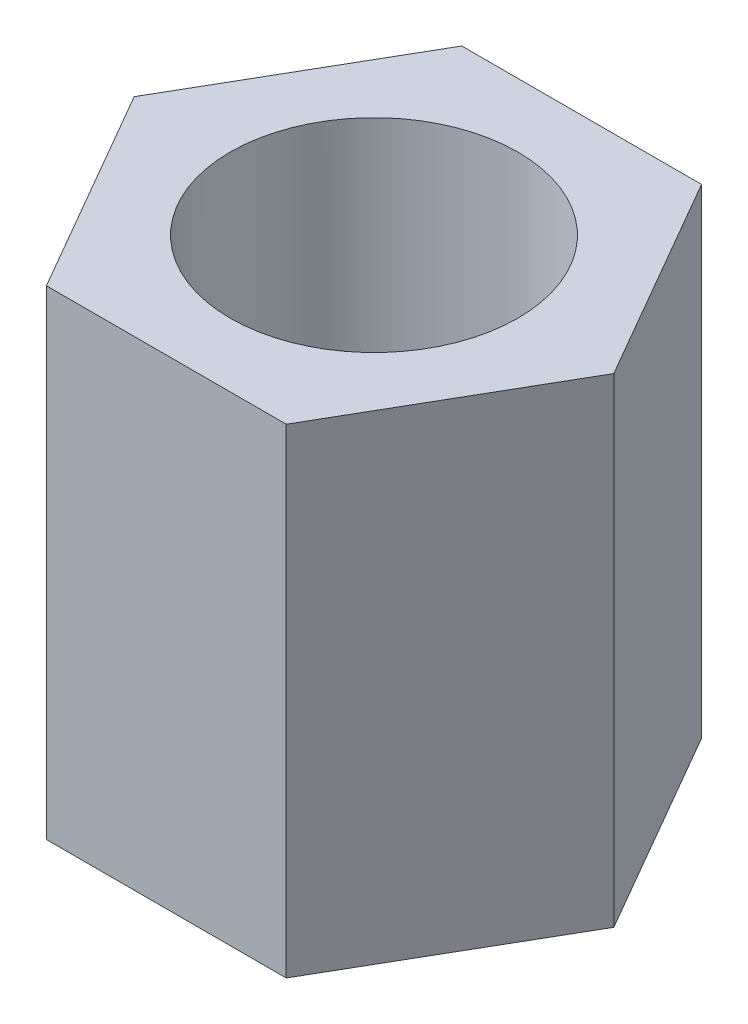
ISO-10303-21;
HEADER;
FILE_DESCRIPTION(('STEP AP214'),'2;1');
FILE_NAME('part.step','',(''),(''),'','','');
FILE_SCHEMA(('AUTOMOTIVE_DESIGN { 1 0 10303 214 1 1 1 1 }'));
ENDSEC;
DATA;
#1=APPLICATION_CONTEXT('core data for automotive mechanical design processes');
#2=APPLICATION_PROTOCOL_DEFINITION('international standard','automotive_design',2000,#1);
#3=PRODUCT_CONTEXT('',#1,'mechanical');
#4=PRODUCT('Part','Part','',(#3));
#5=PRODUCT_RELATED_PRODUCT_CATEGORY('part','',(#4));
#6=PRODUCT_DEFINITION_FORMATION('','',#4);
#7=PRODUCT_DEFINITION_CONTEXT('part definition',#1,'design');
#8=PRODUCT_DEFINITION('design','',#6,#7);
#9=PRODUCT_DEFINITION_SHAPE('','',#8);
#10=(LENGTH_UNIT() NAMED_UNIT(*) SI_UNIT(.MILLI.,.METRE.));
#11=(NAMED_UNIT(*) PLANE_ANGLE_UNIT() SI_UNIT($,.RADIAN.));
#12=(NAMED_UNIT(*) SI_UNIT($,.STERADIAN.) SOLID_ANGLE_UNIT());
#13=UNCERTAINTY_MEASURE_WITH_UNIT(LENGTH_MEASURE(1.E-05),#10,'distance_accuracy_value','');
#14=(GEOMETRIC_REPRESENTATION_CONTEXT(3) GLOBAL_UNCERTAINTY_ASSIGNED_CONTEXT((#13)) GLOBAL_UNIT_ASSIGNED_CONTEXT((#10,
#11,#12)) REPRESENTATION_CONTEXT('',''));
#15=CARTESIAN_POINT('',(0.,0.,0.));
#16=DIRECTION('',(0.,0.,1.));
#17=DIRECTION('',(1.,0.,0.));
#18=AXIS2_PLACEMENT_3D('',#15,#16,#17);
#19=CARTESIAN_POINT('',(0.,5.,0.));
#20=DIRECTION('',(0.,1.,0.));
#21=DIRECTION('',(0.,0.,1.));
#22=AXIS2_PLACEMENT_3D('',#19,#20,#21);
#23=PLANE('',#22);
#24=DIRECTION('',(1.,0.,0.));
#25=VECTOR('',#24,1.);
#26=CARTESIAN_POINT('',(-1.25,5.,2.1650635094611));
#27=LINE('',#26,#25);
#28=CARTESIAN_POINT('',(-1.25,5.,2.1650635094611));
#29=VERTEX_POINT('',#28);
#30=CARTESIAN_POINT('',(1.25,5.,2.1650635094611));
#31=VERTEX_POINT('',#30);
#32=EDGE_CURVE('E129',#29,#31,#27,.T.);
#33=ORIENTED_EDGE('',*,*,#32,.T.);
#34=DIRECTION('',(0.5,0.,-0.866025403784439));
#35=VECTOR('',#34,1.);
#36=CARTESIAN_POINT('',(1.25,5.,2.1650635094611));
#37=LINE('',#36,#35);
#38=CARTESIAN_POINT('',(2.5,5.,0.));
#39=VERTEX_POINT('',#38);
#40=EDGE_CURVE('E87',#31,#39,#37,.T.);
#41=ORIENTED_EDGE('',*,*,#40,.T.);
#42=DIRECTION('',(-0.499999999999999,0.,-0.866025403784439));
#43=VECTOR('',#42,1.);
#44=CARTESIAN_POINT('',(2.5,5.,0.));
#45=LINE('',#44,#43);
#46=CARTESIAN_POINT('',(1.25,5.,-2.1650635094611));
#47=VERTEX_POINT('',#46);
#48=EDGE_CURVE('E100',#39,#47,#45,.T.);
#49=ORIENTED_EDGE('',*,*,#48,.T.);
#50=DIRECTION('',(-1.,0.,0.));
#51=VECTOR('',#50,1.);
#52=CARTESIAN_POINT('',(1.25,5.,-2.1650635094611));
#53=LINE('',#52,#51);
#54=CARTESIAN_POINT('',(-1.25,5.,-2.1650635094611));
#55=VERTEX_POINT('',#54);
#56=EDGE_CURVE('E94',#47,#55,#53,.T.);
#57=ORIENTED_EDGE('',*,*,#56,.T.);
#58=DIRECTION('',(-0.5,0.,0.866025403784438));
#59=VECTOR('',#58,1.);
#60=CARTESIAN_POINT('',(-1.25,5.,-2.1650635094611));
#61=LINE('',#60,#59);
#62=CARTESIAN_POINT('',(-2.5,5.,0.));
#63=VERTEX_POINT('',#62);
#64=EDGE_CURVE('E98',#55,#63,#61,.T.);
#65=ORIENTED_EDGE('',*,*,#64,.T.);
#66=DIRECTION('',(0.499999999999999,0.,0.866025403784439));
#67=VECTOR('',#66,1.);
#68=CARTESIAN_POINT('',(-2.5,5.,0.));
#69=LINE('',#68,#67);
#70=EDGE_CURVE('E50',#63,#29,#69,.T.);
#71=ORIENTED_EDGE('',*,*,#70,.T.);
#72=EDGE_LOOP('',(#33,#41,#49,#57,#65,#71));
#73=FACE_BOUND('',#72,.T.);
#74=CARTESIAN_POINT('',(0.,5.,0.));
#75=DIRECTION('',(0.,1.,0.));
#76=DIRECTION('',(0.,0.,1.));
#77=AXIS2_PLACEMENT_3D('',#74,#75,#76);
#78=CIRCLE('',#77,1.5);
#79=CARTESIAN_POINT('',(0.,5.,1.5));
#80=VERTEX_POINT('',#79);
#81=EDGE_CURVE('E122',#80,#80,#78,.T.);
#82=ORIENTED_EDGE('',*,*,#81,.F.);
#83=EDGE_LOOP('',(#82));
#84=FACE_BOUND('',#83,.T.);
#85=ADVANCED_FACE('F33',(#73,#84),#23,.T.);
#86=CARTESIAN_POINT('',(-1.25,5.,2.1650635094611));
#87=DIRECTION('',(0.,0.,-1.));
#88=DIRECTION('',(-1.,0.,0.));
#89=AXIS2_PLACEMENT_3D('',#86,#87,#88);
#90=PLANE('',#89);
#91=DIRECTION('',(1.,0.,0.));
#92=VECTOR('',#91,1.);
#93=CARTESIAN_POINT('',(-1.25,0.,2.1650635094611));
#94=LINE('',#93,#92);
#95=CARTESIAN_POINT('',(-1.25,0.,2.1650635094611));
#96=VERTEX_POINT('',#95);
#97=CARTESIAN_POINT('',(1.25,0.,2.1650635094611));
#98=VERTEX_POINT('',#97);
#99=EDGE_CURVE('E118',#96,#98,#94,.T.);
#100=ORIENTED_EDGE('',*,*,#99,.T.);
#101=DIRECTION('',(0.,-1.,0.));
#102=VECTOR('',#101,1.);
#103=CARTESIAN_POINT('',(1.25,5.,2.1650635094611));
#104=LINE('',#103,#102);
#105=EDGE_CURVE('E11',#31,#98,#104,.T.);
#106=ORIENTED_EDGE('',*,*,#105,.F.);
#107=ORIENTED_EDGE('',*,*,#32,.F.);
#108=DIRECTION('',(0.,-1.,0.));
#109=VECTOR('',#108,1.);
#110=CARTESIAN_POINT('',(-1.25,5.,2.1650635094611));
#111=LINE('',#110,#109);
#112=EDGE_CURVE('E114',#29,#96,#111,.T.);
#113=ORIENTED_EDGE('',*,*,#112,.T.);
#114=EDGE_LOOP('',(#100,#106,#107,#113));
#115=FACE_BOUND('',#114,.T.);
#116=ADVANCED_FACE('F35',(#115),#90,.F.);
#117=CARTESIAN_POINT('',(1.25,5.,2.1650635094611));
#118=DIRECTION('',(-0.866025403784439,0.,-0.5));
#119=DIRECTION('',(-0.5,0.,0.866025403784439));
#120=AXIS2_PLACEMENT_3D('',#117,#118,#119);
#121=PLANE('',#120);
#122=DIRECTION('',(0.5,0.,-0.866025403784439));
#123=VECTOR('',#122,1.);
#124=CARTESIAN_POINT('',(1.25,0.,2.1650635094611));
#125=LINE('',#124,#123);
#126=CARTESIAN_POINT('',(2.5,0.,0.));
#127=VERTEX_POINT('',#126);
#128=EDGE_CURVE('E121',#98,#127,#125,.T.);
#129=ORIENTED_EDGE('',*,*,#128,.T.);
#130=DIRECTION('',(0.,-1.,0.));
#131=VECTOR('',#130,1.);
#132=CARTESIAN_POINT('',(2.5,5.,0.));
#133=LINE('',#132,#131);
#134=EDGE_CURVE('E42',#39,#127,#133,.T.);
#135=ORIENTED_EDGE('',*,*,#134,.F.);
#136=ORIENTED_EDGE('',*,*,#40,.F.);
#137=ORIENTED_EDGE('',*,*,#105,.T.);
#138=EDGE_LOOP('',(#129,#135,#136,#137));
#139=FACE_BOUND('',#138,.T.);
#140=ADVANCED_FACE('F158',(#139),#121,.F.);
#141=CARTESIAN_POINT('',(2.5,5.,0.));
#142=DIRECTION('',(-0.866025403784439,0.,0.499999999999999));
#143=DIRECTION('',(0.499999999999999,0.,0.866025403784439));
#144=AXIS2_PLACEMENT_3D('',#141,#142,#143);
#145=PLANE('',#144);
#146=DIRECTION('',(-0.499999999999999,0.,-0.866025403784439));
#147=VECTOR('',#146,1.);
#148=CARTESIAN_POINT('',(2.5,0.,0.));
#149=LINE('',#148,#147);
#150=CARTESIAN_POINT('',(1.25,0.,-2.1650635094611));
#151=VERTEX_POINT('',#150);
#152=EDGE_CURVE('E124',#127,#151,#149,.T.);
#153=ORIENTED_EDGE('',*,*,#152,.T.);
#154=DIRECTION('',(0.,-1.,0.));
#155=VECTOR('',#154,1.);
#156=CARTESIAN_POINT('',(1.25,5.,-2.1650635094611));
#157=LINE('',#156,#155);
#158=EDGE_CURVE('E109',#47,#151,#157,.T.);
#159=ORIENTED_EDGE('',*,*,#158,.F.);
#160=ORIENTED_EDGE('',*,*,#48,.F.);
#161=ORIENTED_EDGE('',*,*,#134,.T.);
#162=EDGE_LOOP('',(#153,#159,#160,#161));
#163=FACE_BOUND('',#162,.T.);
#164=ADVANCED_FACE('F135',(#163),#145,.F.);
#165=CARTESIAN_POINT('',(1.25,5.,-2.1650635094611));
#166=DIRECTION('',(0.,0.,1.));
#167=DIRECTION('',(1.,0.,0.));
#168=AXIS2_PLACEMENT_3D('',#165,#166,#167);
#169=PLANE('',#168);
#170=DIRECTION('',(-1.,0.,0.));
#171=VECTOR('',#170,1.);
#172=CARTESIAN_POINT('',(1.25,0.,-2.1650635094611));
#173=LINE('',#172,#171);
#174=CARTESIAN_POINT('',(-1.25,0.,-2.1650635094611));
#175=VERTEX_POINT('',#174);
#176=EDGE_CURVE('E108',#151,#175,#173,.T.);
#177=ORIENTED_EDGE('',*,*,#176,.T.);
#178=DIRECTION('',(0.,-1.,0.));
#179=VECTOR('',#178,1.);
#180=CARTESIAN_POINT('',(-1.25,5.,-2.1650635094611));
#181=LINE('',#180,#179);
#182=EDGE_CURVE('E105',#55,#175,#181,.T.);
#183=ORIENTED_EDGE('',*,*,#182,.F.);
#184=ORIENTED_EDGE('',*,*,#56,.F.);
#185=ORIENTED_EDGE('',*,*,#158,.T.);
#186=EDGE_LOOP('',(#177,#183,#184,#185));
#187=FACE_BOUND('',#186,.T.);
#188=ADVANCED_FACE('F106',(#187),#169,.F.);
#189=CARTESIAN_POINT('',(-1.25,5.,-2.1650635094611));
#190=DIRECTION('',(0.866025403784438,0.,0.5));
#191=DIRECTION('',(0.500000000000001,0.,-0.866025403784438));
#192=AXIS2_PLACEMENT_3D('',#189,#190,#191);
#193=PLANE('',#192);
#194=DIRECTION('',(-0.5,0.,0.866025403784438));
#195=VECTOR('',#194,1.);
#196=CARTESIAN_POINT('',(-1.25,0.,-2.1650635094611));
#197=LINE('',#196,#195);
#198=CARTESIAN_POINT('',(-2.5,0.,0.));
#199=VERTEX_POINT('',#198);
#200=EDGE_CURVE('E73',#175,#199,#197,.T.);
#201=ORIENTED_EDGE('',*,*,#200,.T.);
#202=DIRECTION('',(0.,-1.,0.));
#203=VECTOR('',#202,1.);
#204=CARTESIAN_POINT('',(-2.5,5.,0.));
#205=LINE('',#204,#203);
#206=EDGE_CURVE('E110',#63,#199,#205,.T.);
#207=ORIENTED_EDGE('',*,*,#206,.F.);
#208=ORIENTED_EDGE('',*,*,#64,.F.);
#209=ORIENTED_EDGE('',*,*,#182,.T.);
#210=EDGE_LOOP('',(#201,#207,#208,#209));
#211=FACE_BOUND('',#210,.T.);
#212=ADVANCED_FACE('F112',(#211),#193,.F.);
#213=CARTESIAN_POINT('',(-2.5,5.,0.));
#214=DIRECTION('',(0.866025403784439,0.,-0.499999999999999));
#215=DIRECTION('',(-0.499999999999999,0.,-0.866025403784439));
#216=AXIS2_PLACEMENT_3D('',#213,#214,#215);
#217=PLANE('',#216);
#218=DIRECTION('',(0.499999999999999,0.,0.866025403784439));
#219=VECTOR('',#218,1.);
#220=CARTESIAN_POINT('',(-2.5,0.,0.));
#221=LINE('',#220,#219);
#222=EDGE_CURVE('E79',#199,#96,#221,.T.);
#223=ORIENTED_EDGE('',*,*,#222,.T.);
#224=ORIENTED_EDGE('',*,*,#112,.F.);
#225=ORIENTED_EDGE('',*,*,#70,.F.);
#226=ORIENTED_EDGE('',*,*,#206,.T.);
#227=EDGE_LOOP('',(#223,#224,#225,#226));
#228=FACE_BOUND('',#227,.T.);
#229=ADVANCED_FACE('F142',(#228),#217,.F.);
#230=CARTESIAN_POINT('',(0.,0.,0.));
#231=DIRECTION('',(0.,1.,0.));
#232=DIRECTION('',(0.,0.,1.));
#233=AXIS2_PLACEMENT_3D('',#230,#231,#232);
#234=PLANE('',#233);
#235=CARTESIAN_POINT('',(0.,0.,0.));
#236=DIRECTION('',(0.,-1.,0.));
#237=DIRECTION('',(0.,0.,-1.));
#238=AXIS2_PLACEMENT_3D('',#235,#236,#237);
#239=CIRCLE('',#238,1.5);
#240=CARTESIAN_POINT('',(0.,0.,-1.5));
#241=VERTEX_POINT('',#240);
#242=EDGE_CURVE('E169',#241,#241,#239,.T.);
#243=ORIENTED_EDGE('',*,*,#242,.F.);
#244=EDGE_LOOP('',(#243));
#245=FACE_BOUND('',#244,.T.);
#246=ORIENTED_EDGE('',*,*,#99,.F.);
#247=ORIENTED_EDGE('',*,*,#222,.F.);
#248=ORIENTED_EDGE('',*,*,#200,.F.);
#249=ORIENTED_EDGE('',*,*,#176,.F.);
#250=ORIENTED_EDGE('',*,*,#152,.F.);
#251=ORIENTED_EDGE('',*,*,#128,.F.);
#252=EDGE_LOOP('',(#246,#247,#248,#249,#250,#251));
#253=FACE_BOUND('',#252,.T.);
#254=ADVANCED_FACE('F138',(#245,#253),#234,.F.);
#255=CARTESIAN_POINT('',(0.,10.,0.));
#256=DIRECTION('',(0.,-1.,0.));
#257=DIRECTION('',(0.,0.,-1.));
#258=AXIS2_PLACEMENT_3D('',#255,#256,#257);
#259=CYLINDRICAL_SURFACE('',#258,1.5);
#260=ORIENTED_EDGE('',*,*,#81,.T.);
#261=EDGE_LOOP('',(#260));
#262=FACE_BOUND('',#261,.T.);
#263=ORIENTED_EDGE('',*,*,#242,.T.);
#264=EDGE_LOOP('',(#263));
#265=FACE_BOUND('',#264,.T.);
#266=ADVANCED_FACE('F149',(#262,#265),#259,.F.);
#267=CLOSED_SHELL('',(#85,#116,#140,#164,#188,#212,#229,#254,#266));
#268=MANIFOLD_SOLID_BREP('B2',#267);
#269=ADVANCED_BREP_SHAPE_REPRESENTATION('',(#18,#268),#14);
#270=SHAPE_DEFINITION_REPRESENTATION(#9,#269);
ENDSEC;
END-ISO-10303-21;
